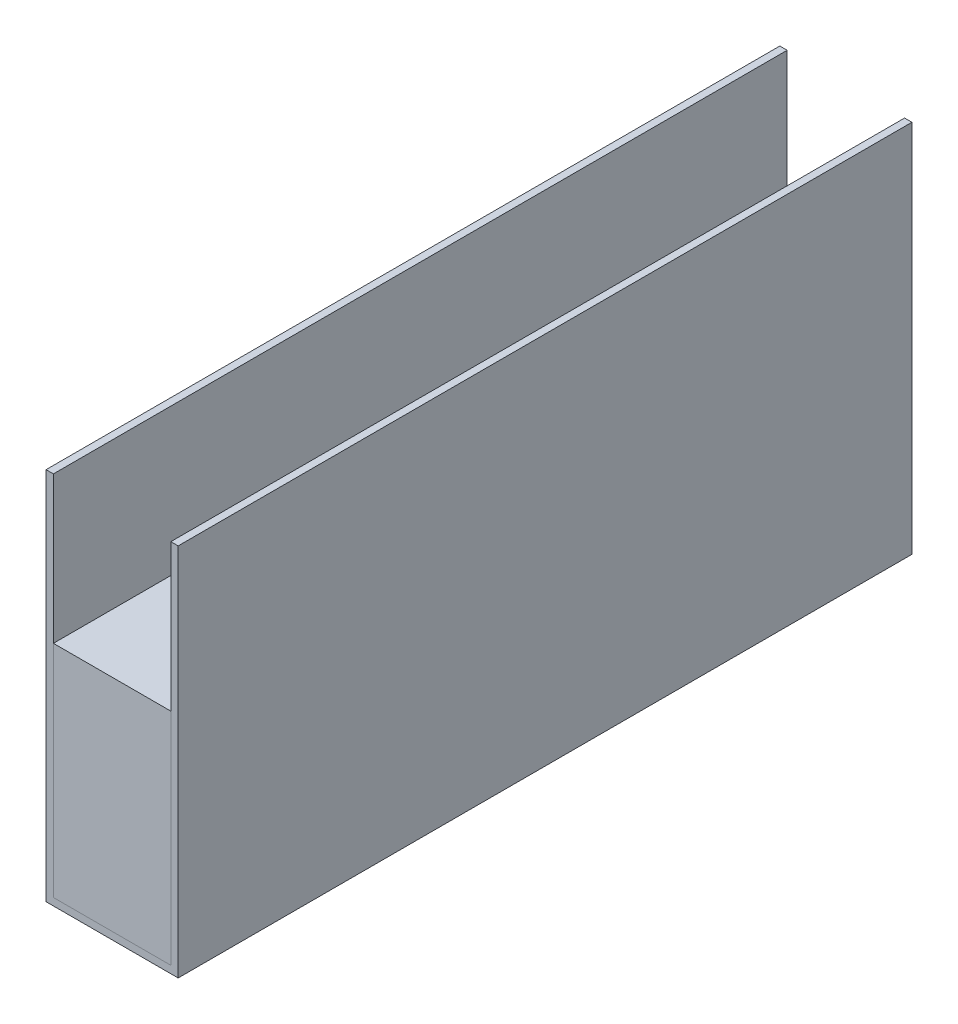
ISO-10303-21;
HEADER;
FILE_DESCRIPTION(('STEP AP214'),'2;1');
FILE_NAME('part.step','',(''),(''),'','','');
FILE_SCHEMA(('AUTOMOTIVE_DESIGN { 1 0 10303 214 1 1 1 1 }'));
ENDSEC;
DATA;
#1=APPLICATION_CONTEXT('core data for automotive mechanical design processes');
#2=APPLICATION_PROTOCOL_DEFINITION('international standard','automotive_design',2000,#1);
#3=PRODUCT_CONTEXT('',#1,'mechanical');
#4=PRODUCT('Part','Part','',(#3));
#5=PRODUCT_RELATED_PRODUCT_CATEGORY('part','',(#4));
#6=PRODUCT_DEFINITION_FORMATION('','',#4);
#7=PRODUCT_DEFINITION_CONTEXT('part definition',#1,'design');
#8=PRODUCT_DEFINITION('design','',#6,#7);
#9=PRODUCT_DEFINITION_SHAPE('','',#8);
#10=(LENGTH_UNIT() NAMED_UNIT(*) SI_UNIT(.MILLI.,.METRE.));
#11=(NAMED_UNIT(*) PLANE_ANGLE_UNIT() SI_UNIT($,.RADIAN.));
#12=(NAMED_UNIT(*) SI_UNIT($,.STERADIAN.) SOLID_ANGLE_UNIT());
#13=UNCERTAINTY_MEASURE_WITH_UNIT(LENGTH_MEASURE(1.E-05),#10,'distance_accuracy_value','');
#14=(GEOMETRIC_REPRESENTATION_CONTEXT(3) GLOBAL_UNCERTAINTY_ASSIGNED_CONTEXT((#13)) GLOBAL_UNIT_ASSIGNED_CONTEXT((#10,
#11,#12)) REPRESENTATION_CONTEXT('',''));
#15=CARTESIAN_POINT('',(0.,0.,0.));
#16=DIRECTION('',(0.,0.,1.));
#17=DIRECTION('',(1.,0.,0.));
#18=AXIS2_PLACEMENT_3D('',#15,#16,#17);
#19=CARTESIAN_POINT('',(0.,25.,500.));
#20=DIRECTION('',(0.,1.,0.));
#21=DIRECTION('',(0.,0.,1.));
#22=AXIS2_PLACEMENT_3D('',#19,#20,#21);
#23=PLANE('',#22);
#24=DIRECTION('',(1.,0.,0.));
#25=VECTOR('',#24,1.);
#26=CARTESIAN_POINT('',(0.,25.,0.));
#27=LINE('',#26,#25);
#28=CARTESIAN_POINT('',(-40.,25.,0.));
#29=VERTEX_POINT('',#28);
#30=CARTESIAN_POINT('',(40.,25.,0.));
#31=VERTEX_POINT('',#30);
#32=EDGE_CURVE('E121',#29,#31,#27,.T.);
#33=ORIENTED_EDGE('',*,*,#32,.F.);
#34=DIRECTION('',(0.,0.,-1.));
#35=VECTOR('',#34,1.);
#36=CARTESIAN_POINT('',(-40.,25.,500.));
#37=LINE('',#36,#35);
#38=CARTESIAN_POINT('',(-40.,25.,500.));
#39=VERTEX_POINT('',#38);
#40=EDGE_CURVE('E12',#39,#29,#37,.T.);
#41=ORIENTED_EDGE('',*,*,#40,.F.);
#42=DIRECTION('',(1.,0.,0.));
#43=VECTOR('',#42,1.);
#44=CARTESIAN_POINT('',(0.,25.,500.));
#45=LINE('',#44,#43);
#46=CARTESIAN_POINT('',(40.,25.,500.));
#47=VERTEX_POINT('',#46);
#48=EDGE_CURVE('E102',#39,#47,#45,.T.);
#49=ORIENTED_EDGE('',*,*,#48,.T.);
#50=DIRECTION('',(0.,0.,-1.));
#51=VECTOR('',#50,1.);
#52=CARTESIAN_POINT('',(40.,25.,500.));
#53=LINE('',#52,#51);
#54=EDGE_CURVE('E70',#47,#31,#53,.T.);
#55=ORIENTED_EDGE('',*,*,#54,.T.);
#56=EDGE_LOOP('',(#33,#41,#49,#55));
#57=FACE_BOUND('',#56,.T.);
#58=ADVANCED_FACE('F53',(#57),#23,.T.);
#59=CARTESIAN_POINT('',(-40.,0.,500.));
#60=DIRECTION('',(1.,0.,0.));
#61=DIRECTION('',(0.,0.,-1.));
#62=AXIS2_PLACEMENT_3D('',#59,#60,#61);
#63=PLANE('',#62);
#64=DIRECTION('',(0.,-1.,0.));
#65=VECTOR('',#64,1.);
#66=CARTESIAN_POINT('',(-40.,0.,0.));
#67=LINE('',#66,#65);
#68=CARTESIAN_POINT('',(-40.,-125.,0.));
#69=VERTEX_POINT('',#68);
#70=EDGE_CURVE('E109',#29,#69,#67,.T.);
#71=ORIENTED_EDGE('',*,*,#70,.T.);
#72=DIRECTION('',(0.,0.,-1.));
#73=VECTOR('',#72,1.);
#74=CARTESIAN_POINT('',(-40.,-125.,500.));
#75=LINE('',#74,#73);
#76=CARTESIAN_POINT('',(-40.,-125.,500.));
#77=VERTEX_POINT('',#76);
#78=EDGE_CURVE('E62',#77,#69,#75,.T.);
#79=ORIENTED_EDGE('',*,*,#78,.F.);
#80=DIRECTION('',(0.,-1.,0.));
#81=VECTOR('',#80,1.);
#82=CARTESIAN_POINT('',(-40.,0.,500.));
#83=LINE('',#82,#81);
#84=EDGE_CURVE('E96',#39,#77,#83,.T.);
#85=ORIENTED_EDGE('',*,*,#84,.F.);
#86=ORIENTED_EDGE('',*,*,#40,.T.);
#87=EDGE_LOOP('',(#71,#79,#85,#86));
#88=FACE_BOUND('',#87,.T.);
#89=ADVANCED_FACE('F107',(#88),#63,.F.);
#90=CARTESIAN_POINT('',(0.,-125.,500.));
#91=DIRECTION('',(0.,1.,0.));
#92=DIRECTION('',(0.,0.,1.));
#93=AXIS2_PLACEMENT_3D('',#90,#91,#92);
#94=PLANE('',#93);
#95=DIRECTION('',(1.,0.,0.));
#96=VECTOR('',#95,1.);
#97=CARTESIAN_POINT('',(0.,-125.,0.));
#98=LINE('',#97,#96);
#99=CARTESIAN_POINT('',(40.,-125.,0.));
#100=VERTEX_POINT('',#99);
#101=EDGE_CURVE('E126',#69,#100,#98,.T.);
#102=ORIENTED_EDGE('',*,*,#101,.T.);
#103=DIRECTION('',(0.,0.,-1.));
#104=VECTOR('',#103,1.);
#105=CARTESIAN_POINT('',(40.,-125.,500.));
#106=LINE('',#105,#104);
#107=CARTESIAN_POINT('',(40.,-125.,500.));
#108=VERTEX_POINT('',#107);
#109=EDGE_CURVE('E84',#108,#100,#106,.T.);
#110=ORIENTED_EDGE('',*,*,#109,.F.);
#111=DIRECTION('',(1.,0.,0.));
#112=VECTOR('',#111,1.);
#113=CARTESIAN_POINT('',(0.,-125.,500.));
#114=LINE('',#113,#112);
#115=EDGE_CURVE('E101',#77,#108,#114,.T.);
#116=ORIENTED_EDGE('',*,*,#115,.F.);
#117=ORIENTED_EDGE('',*,*,#78,.T.);
#118=EDGE_LOOP('',(#102,#110,#116,#117));
#119=FACE_BOUND('',#118,.T.);
#120=ADVANCED_FACE('F113',(#119),#94,.F.);
#121=CARTESIAN_POINT('',(40.,0.,500.));
#122=DIRECTION('',(1.,0.,0.));
#123=DIRECTION('',(0.,0.,-1.));
#124=AXIS2_PLACEMENT_3D('',#121,#122,#123);
#125=PLANE('',#124);
#126=DIRECTION('',(0.,-1.,0.));
#127=VECTOR('',#126,1.);
#128=CARTESIAN_POINT('',(40.,0.,0.));
#129=LINE('',#128,#127);
#130=EDGE_CURVE('E129',#31,#100,#129,.T.);
#131=ORIENTED_EDGE('',*,*,#130,.F.);
#132=ORIENTED_EDGE('',*,*,#54,.F.);
#133=DIRECTION('',(0.,-1.,0.));
#134=VECTOR('',#133,1.);
#135=CARTESIAN_POINT('',(40.,0.,500.));
#136=LINE('',#135,#134);
#137=EDGE_CURVE('E115',#47,#108,#136,.T.);
#138=ORIENTED_EDGE('',*,*,#137,.T.);
#139=ORIENTED_EDGE('',*,*,#109,.T.);
#140=EDGE_LOOP('',(#131,#132,#138,#139));
#141=FACE_BOUND('',#140,.T.);
#142=ADVANCED_FACE('F138',(#141),#125,.T.);
#143=CARTESIAN_POINT('',(0.,0.,500.));
#144=DIRECTION('',(0.,0.,1.));
#145=DIRECTION('',(1.,0.,0.));
#146=AXIS2_PLACEMENT_3D('',#143,#144,#145);
#147=PLANE('',#146);
#148=ORIENTED_EDGE('',*,*,#48,.F.);
#149=ORIENTED_EDGE('',*,*,#84,.T.);
#150=ORIENTED_EDGE('',*,*,#115,.T.);
#151=ORIENTED_EDGE('',*,*,#137,.F.);
#152=EDGE_LOOP('',(#148,#149,#150,#151));
#153=FACE_BOUND('',#152,.T.);
#154=ADVANCED_FACE('F98',(#153),#147,.T.);
#155=CARTESIAN_POINT('',(0.,0.,0.));
#156=DIRECTION('',(0.,0.,1.));
#157=DIRECTION('',(1.,0.,0.));
#158=AXIS2_PLACEMENT_3D('',#155,#156,#157);
#159=PLANE('',#158);
#160=ORIENTED_EDGE('',*,*,#32,.T.);
#161=ORIENTED_EDGE('',*,*,#130,.T.);
#162=ORIENTED_EDGE('',*,*,#101,.F.);
#163=ORIENTED_EDGE('',*,*,#70,.F.);
#164=EDGE_LOOP('',(#160,#161,#162,#163));
#165=FACE_BOUND('',#164,.T.);
#166=ADVANCED_FACE('F145',(#165),#159,.F.);
#167=CLOSED_SHELL('',(#58,#89,#120,#142,#154,#166));
#168=MANIFOLD_SOLID_BREP('B2',#167);
#169=CARTESIAN_POINT('',(-40.,-125.,500.));
#170=DIRECTION('',(0.,1.,0.));
#171=DIRECTION('',(0.,0.,1.));
#172=AXIS2_PLACEMENT_3D('',#169,#170,#171);
#173=PLANE('',#172);
#174=DIRECTION('',(1.,0.,0.));
#175=VECTOR('',#174,1.);
#176=CARTESIAN_POINT('',(-40.,-125.,0.));
#177=LINE('',#176,#175);
#178=CARTESIAN_POINT('',(-40.,-125.,0.));
#179=VERTEX_POINT('',#178);
#180=CARTESIAN_POINT('',(40.,-125.,0.));
#181=VERTEX_POINT('',#180);
#182=EDGE_CURVE('E292',#179,#181,#177,.T.);
#183=ORIENTED_EDGE('',*,*,#182,.F.);
#184=DIRECTION('',(0.,0.,-1.));
#185=VECTOR('',#184,1.);
#186=CARTESIAN_POINT('',(-40.,-125.,500.));
#187=LINE('',#186,#185);
#188=CARTESIAN_POINT('',(-40.,-125.,500.));
#189=VERTEX_POINT('',#188);
#190=EDGE_CURVE('E51',#189,#179,#187,.T.);
#191=ORIENTED_EDGE('',*,*,#190,.F.);
#192=DIRECTION('',(1.,0.,0.));
#193=VECTOR('',#192,1.);
#194=CARTESIAN_POINT('',(-40.,-125.,500.));
#195=LINE('',#194,#193);
#196=CARTESIAN_POINT('',(40.,-125.,500.));
#197=VERTEX_POINT('',#196);
#198=EDGE_CURVE('E312',#189,#197,#195,.T.);
#199=ORIENTED_EDGE('',*,*,#198,.T.);
#200=DIRECTION('',(0.,0.,-1.));
#201=VECTOR('',#200,1.);
#202=CARTESIAN_POINT('',(40.,-125.,500.));
#203=LINE('',#202,#201);
#204=EDGE_CURVE('E201',#197,#181,#203,.T.);
#205=ORIENTED_EDGE('',*,*,#204,.T.);
#206=EDGE_LOOP('',(#183,#191,#199,#205));
#207=FACE_BOUND('',#206,.T.);
#208=ADVANCED_FACE('F198',(#207),#173,.T.);
#209=CARTESIAN_POINT('',(-40.,125.,500.));
#210=DIRECTION('',(1.,0.,0.));
#211=DIRECTION('',(0.,0.,-1.));
#212=AXIS2_PLACEMENT_3D('',#209,#210,#211);
#213=PLANE('',#212);
#214=DIRECTION('',(0.,-1.,0.));
#215=VECTOR('',#214,1.);
#216=CARTESIAN_POINT('',(-40.,125.,0.));
#217=LINE('',#216,#215);
#218=CARTESIAN_POINT('',(-40.,125.,0.));
#219=VERTEX_POINT('',#218);
#220=EDGE_CURVE('E310',#219,#179,#217,.T.);
#221=ORIENTED_EDGE('',*,*,#220,.F.);
#222=DIRECTION('',(0.,0.,-1.));
#223=VECTOR('',#222,1.);
#224=CARTESIAN_POINT('',(-40.,125.,500.));
#225=LINE('',#224,#223);
#226=CARTESIAN_POINT('',(-40.,125.,500.));
#227=VERTEX_POINT('',#226);
#228=EDGE_CURVE('E207',#227,#219,#225,.T.);
#229=ORIENTED_EDGE('',*,*,#228,.F.);
#230=DIRECTION('',(0.,-1.,0.));
#231=VECTOR('',#230,1.);
#232=CARTESIAN_POINT('',(-40.,125.,500.));
#233=LINE('',#232,#231);
#234=EDGE_CURVE('E287',#227,#189,#233,.T.);
#235=ORIENTED_EDGE('',*,*,#234,.T.);
#236=ORIENTED_EDGE('',*,*,#190,.T.);
#237=EDGE_LOOP('',(#221,#229,#235,#236));
#238=FACE_BOUND('',#237,.T.);
#239=ADVANCED_FACE('F326',(#238),#213,.T.);
#240=CARTESIAN_POINT('',(-45.,125.,500.));
#241=DIRECTION('',(0.,1.,0.));
#242=DIRECTION('',(0.,0.,1.));
#243=AXIS2_PLACEMENT_3D('',#240,#241,#242);
#244=PLANE('',#243);
#245=DIRECTION('',(1.,0.,0.));
#246=VECTOR('',#245,1.);
#247=CARTESIAN_POINT('',(-45.,125.,0.));
#248=LINE('',#247,#246);
#249=CARTESIAN_POINT('',(-45.,125.,0.));
#250=VERTEX_POINT('',#249);
#251=EDGE_CURVE('E274',#250,#219,#248,.T.);
#252=ORIENTED_EDGE('',*,*,#251,.F.);
#253=DIRECTION('',(0.,0.,-1.));
#254=VECTOR('',#253,1.);
#255=CARTESIAN_POINT('',(-45.,125.,500.));
#256=LINE('',#255,#254);
#257=CARTESIAN_POINT('',(-45.,125.,500.));
#258=VERTEX_POINT('',#257);
#259=EDGE_CURVE('E268',#258,#250,#256,.T.);
#260=ORIENTED_EDGE('',*,*,#259,.F.);
#261=DIRECTION('',(1.,0.,0.));
#262=VECTOR('',#261,1.);
#263=CARTESIAN_POINT('',(-45.,125.,500.));
#264=LINE('',#263,#262);
#265=EDGE_CURVE('E272',#258,#227,#264,.T.);
#266=ORIENTED_EDGE('',*,*,#265,.T.);
#267=ORIENTED_EDGE('',*,*,#228,.T.);
#268=EDGE_LOOP('',(#252,#260,#266,#267));
#269=FACE_BOUND('',#268,.T.);
#270=ADVANCED_FACE('F270',(#269),#244,.T.);
#271=CARTESIAN_POINT('',(-45.,125.,500.));
#272=DIRECTION('',(1.,0.,0.));
#273=DIRECTION('',(0.,0.,-1.));
#274=AXIS2_PLACEMENT_3D('',#271,#272,#273);
#275=PLANE('',#274);
#276=DIRECTION('',(0.,-1.,0.));
#277=VECTOR('',#276,1.);
#278=CARTESIAN_POINT('',(-45.,125.,0.));
#279=LINE('',#278,#277);
#280=CARTESIAN_POINT('',(-45.,-130.,0.));
#281=VERTEX_POINT('',#280);
#282=EDGE_CURVE('E307',#250,#281,#279,.T.);
#283=ORIENTED_EDGE('',*,*,#282,.T.);
#284=DIRECTION('',(0.,0.,-1.));
#285=VECTOR('',#284,1.);
#286=CARTESIAN_POINT('',(-45.,-130.,500.));
#287=LINE('',#286,#285);
#288=CARTESIAN_POINT('',(-45.,-130.,500.));
#289=VERTEX_POINT('',#288);
#290=EDGE_CURVE('E277',#289,#281,#287,.T.);
#291=ORIENTED_EDGE('',*,*,#290,.F.);
#292=DIRECTION('',(0.,-1.,0.));
#293=VECTOR('',#292,1.);
#294=CARTESIAN_POINT('',(-45.,125.,500.));
#295=LINE('',#294,#293);
#296=EDGE_CURVE('E280',#258,#289,#295,.T.);
#297=ORIENTED_EDGE('',*,*,#296,.F.);
#298=ORIENTED_EDGE('',*,*,#259,.T.);
#299=EDGE_LOOP('',(#283,#291,#297,#298));
#300=FACE_BOUND('',#299,.T.);
#301=ADVANCED_FACE('F281',(#300),#275,.F.);
#302=CARTESIAN_POINT('',(-45.,-130.,500.));
#303=DIRECTION('',(0.,1.,0.));
#304=DIRECTION('',(0.,0.,1.));
#305=AXIS2_PLACEMENT_3D('',#302,#303,#304);
#306=PLANE('',#305);
#307=DIRECTION('',(1.,0.,0.));
#308=VECTOR('',#307,1.);
#309=CARTESIAN_POINT('',(-45.,-130.,0.));
#310=LINE('',#309,#308);
#311=CARTESIAN_POINT('',(45.,-130.,0.));
#312=VERTEX_POINT('',#311);
#313=EDGE_CURVE('E304',#281,#312,#310,.T.);
#314=ORIENTED_EDGE('',*,*,#313,.T.);
#315=DIRECTION('',(0.,0.,-1.));
#316=VECTOR('',#315,1.);
#317=CARTESIAN_POINT('',(45.,-130.,500.));
#318=LINE('',#317,#316);
#319=CARTESIAN_POINT('',(45.,-130.,500.));
#320=VERTEX_POINT('',#319);
#321=EDGE_CURVE('E316',#320,#312,#318,.T.);
#322=ORIENTED_EDGE('',*,*,#321,.F.);
#323=DIRECTION('',(1.,0.,0.));
#324=VECTOR('',#323,1.);
#325=CARTESIAN_POINT('',(-45.,-130.,500.));
#326=LINE('',#325,#324);
#327=EDGE_CURVE('E284',#289,#320,#326,.T.);
#328=ORIENTED_EDGE('',*,*,#327,.F.);
#329=ORIENTED_EDGE('',*,*,#290,.T.);
#330=EDGE_LOOP('',(#314,#322,#328,#329));
#331=FACE_BOUND('',#330,.T.);
#332=ADVANCED_FACE('F339',(#331),#306,.F.);
#333=CARTESIAN_POINT('',(45.,125.,500.));
#334=DIRECTION('',(1.,0.,0.));
#335=DIRECTION('',(0.,1.,0.));
#336=AXIS2_PLACEMENT_3D('',#333,#334,#335);
#337=PLANE('',#336);
#338=DIRECTION('',(0.,-1.,0.));
#339=VECTOR('',#338,1.);
#340=CARTESIAN_POINT('',(45.,125.,0.));
#341=LINE('',#340,#339);
#342=CARTESIAN_POINT('',(45.,125.,0.));
#343=VERTEX_POINT('',#342);
#344=EDGE_CURVE('E301',#343,#312,#341,.T.);
#345=ORIENTED_EDGE('',*,*,#344,.F.);
#346=DIRECTION('',(0.,0.,-1.));
#347=VECTOR('',#346,1.);
#348=CARTESIAN_POINT('',(45.,125.,500.));
#349=LINE('',#348,#347);
#350=CARTESIAN_POINT('',(45.,125.,500.));
#351=VERTEX_POINT('',#350);
#352=EDGE_CURVE('E318',#351,#343,#349,.T.);
#353=ORIENTED_EDGE('',*,*,#352,.F.);
#354=DIRECTION('',(0.,-1.,0.));
#355=VECTOR('',#354,1.);
#356=CARTESIAN_POINT('',(45.,125.,500.));
#357=LINE('',#356,#355);
#358=EDGE_CURVE('E417',#351,#320,#357,.T.);
#359=ORIENTED_EDGE('',*,*,#358,.T.);
#360=ORIENTED_EDGE('',*,*,#321,.T.);
#361=EDGE_LOOP('',(#345,#353,#359,#360));
#362=FACE_BOUND('',#361,.T.);
#363=ADVANCED_FACE('F342',(#362),#337,.T.);
#364=CARTESIAN_POINT('',(40.,125.,500.));
#365=DIRECTION('',(0.,1.,0.));
#366=DIRECTION('',(0.,0.,1.));
#367=AXIS2_PLACEMENT_3D('',#364,#365,#366);
#368=PLANE('',#367);
#369=DIRECTION('',(1.,0.,0.));
#370=VECTOR('',#369,1.);
#371=CARTESIAN_POINT('',(40.,125.,0.));
#372=LINE('',#371,#370);
#373=CARTESIAN_POINT('',(40.,125.,0.));
#374=VERTEX_POINT('',#373);
#375=EDGE_CURVE('E298',#374,#343,#372,.T.);
#376=ORIENTED_EDGE('',*,*,#375,.F.);
#377=DIRECTION('',(0.,0.,-1.));
#378=VECTOR('',#377,1.);
#379=CARTESIAN_POINT('',(40.,125.,500.));
#380=LINE('',#379,#378);
#381=CARTESIAN_POINT('',(40.,125.,500.));
#382=VERTEX_POINT('',#381);
#383=EDGE_CURVE('E319',#382,#374,#380,.T.);
#384=ORIENTED_EDGE('',*,*,#383,.F.);
#385=DIRECTION('',(1.,0.,0.));
#386=VECTOR('',#385,1.);
#387=CARTESIAN_POINT('',(40.,125.,500.));
#388=LINE('',#387,#386);
#389=EDGE_CURVE('E418',#382,#351,#388,.T.);
#390=ORIENTED_EDGE('',*,*,#389,.T.);
#391=ORIENTED_EDGE('',*,*,#352,.T.);
#392=EDGE_LOOP('',(#376,#384,#390,#391));
#393=FACE_BOUND('',#392,.T.);
#394=ADVANCED_FACE('F346',(#393),#368,.T.);
#395=CARTESIAN_POINT('',(40.,125.,500.));
#396=DIRECTION('',(1.,0.,0.));
#397=DIRECTION('',(0.,0.,-1.));
#398=AXIS2_PLACEMENT_3D('',#395,#396,#397);
#399=PLANE('',#398);
#400=DIRECTION('',(0.,-1.,0.));
#401=VECTOR('',#400,1.);
#402=CARTESIAN_POINT('',(40.,125.,0.));
#403=LINE('',#402,#401);
#404=EDGE_CURVE('E295',#374,#181,#403,.T.);
#405=ORIENTED_EDGE('',*,*,#404,.T.);
#406=ORIENTED_EDGE('',*,*,#204,.F.);
#407=DIRECTION('',(0.,-1.,0.));
#408=VECTOR('',#407,1.);
#409=CARTESIAN_POINT('',(40.,125.,500.));
#410=LINE('',#409,#408);
#411=EDGE_CURVE('E254',#382,#197,#410,.T.);
#412=ORIENTED_EDGE('',*,*,#411,.F.);
#413=ORIENTED_EDGE('',*,*,#383,.T.);
#414=EDGE_LOOP('',(#405,#406,#412,#413));
#415=FACE_BOUND('',#414,.T.);
#416=ADVANCED_FACE('F322',(#415),#399,.F.);
#417=CARTESIAN_POINT('',(0.,0.,500.));
#418=DIRECTION('',(0.,0.,-1.));
#419=DIRECTION('',(-1.,0.,0.));
#420=AXIS2_PLACEMENT_3D('',#417,#418,#419);
#421=PLANE('',#420);
#422=ORIENTED_EDGE('',*,*,#198,.F.);
#423=ORIENTED_EDGE('',*,*,#234,.F.);
#424=ORIENTED_EDGE('',*,*,#265,.F.);
#425=ORIENTED_EDGE('',*,*,#296,.T.);
#426=ORIENTED_EDGE('',*,*,#327,.T.);
#427=ORIENTED_EDGE('',*,*,#358,.F.);
#428=ORIENTED_EDGE('',*,*,#389,.F.);
#429=ORIENTED_EDGE('',*,*,#411,.T.);
#430=EDGE_LOOP('',(#422,#423,#424,#425,#426,#427,#428,#429));
#431=FACE_BOUND('',#430,.T.);
#432=ADVANCED_FACE('F286',(#431),#421,.F.);
#433=CARTESIAN_POINT('',(0.,0.,0.));
#434=DIRECTION('',(0.,0.,-1.));
#435=DIRECTION('',(-1.,0.,0.));
#436=AXIS2_PLACEMENT_3D('',#433,#434,#435);
#437=PLANE('',#436);
#438=ORIENTED_EDGE('',*,*,#182,.T.);
#439=ORIENTED_EDGE('',*,*,#404,.F.);
#440=ORIENTED_EDGE('',*,*,#375,.T.);
#441=ORIENTED_EDGE('',*,*,#344,.T.);
#442=ORIENTED_EDGE('',*,*,#313,.F.);
#443=ORIENTED_EDGE('',*,*,#282,.F.);
#444=ORIENTED_EDGE('',*,*,#251,.T.);
#445=ORIENTED_EDGE('',*,*,#220,.T.);
#446=EDGE_LOOP('',(#438,#439,#440,#441,#442,#443,#444,#445));
#447=FACE_BOUND('',#446,.T.);
#448=ADVANCED_FACE('F325',(#447),#437,.T.);
#449=CLOSED_SHELL('',(#208,#239,#270,#301,#332,#363,#394,#416,#432,#448));
#450=MANIFOLD_SOLID_BREP('B6',#449);
#451=ADVANCED_BREP_SHAPE_REPRESENTATION('',(#18,#168,#450),#14);
#452=SHAPE_DEFINITION_REPRESENTATION(#9,#451);
ENDSEC;
END-ISO-10303-21;
